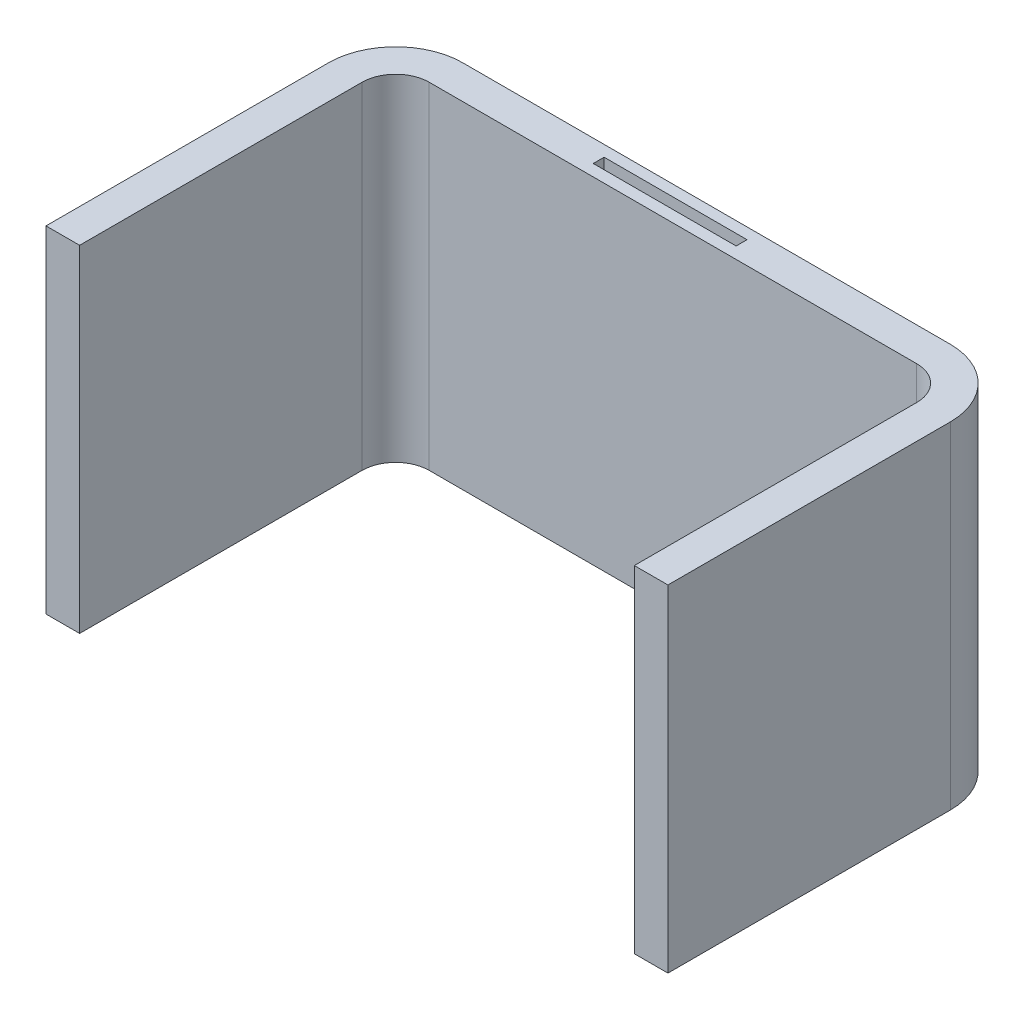
ISO-10303-21;
HEADER;
FILE_DESCRIPTION(('STEP AP214'),'2;1');
FILE_NAME('part.step','',(''),(''),'','','');
FILE_SCHEMA(('AUTOMOTIVE_DESIGN { 1 0 10303 214 1 1 1 1 }'));
ENDSEC;
DATA;
#1=APPLICATION_CONTEXT('core data for automotive mechanical design processes');
#2=APPLICATION_PROTOCOL_DEFINITION('international standard','automotive_design',2000,#1);
#3=PRODUCT_CONTEXT('',#1,'mechanical');
#4=PRODUCT('Part','Part','',(#3));
#5=PRODUCT_RELATED_PRODUCT_CATEGORY('part','',(#4));
#6=PRODUCT_DEFINITION_FORMATION('','',#4);
#7=PRODUCT_DEFINITION_CONTEXT('part definition',#1,'design');
#8=PRODUCT_DEFINITION('design','',#6,#7);
#9=PRODUCT_DEFINITION_SHAPE('','',#8);
#10=(LENGTH_UNIT() NAMED_UNIT(*) SI_UNIT(.MILLI.,.METRE.));
#11=(NAMED_UNIT(*) PLANE_ANGLE_UNIT() SI_UNIT($,.RADIAN.));
#12=(NAMED_UNIT(*) SI_UNIT($,.STERADIAN.) SOLID_ANGLE_UNIT());
#13=UNCERTAINTY_MEASURE_WITH_UNIT(LENGTH_MEASURE(1.E-05),#10,'distance_accuracy_value','');
#14=(GEOMETRIC_REPRESENTATION_CONTEXT(3) GLOBAL_UNCERTAINTY_ASSIGNED_CONTEXT((#13)) GLOBAL_UNIT_ASSIGNED_CONTEXT((#10,
#11,#12)) REPRESENTATION_CONTEXT('',''));
#15=CARTESIAN_POINT('',(0.,0.,0.));
#16=DIRECTION('',(0.,0.,1.));
#17=DIRECTION('',(1.,0.,0.));
#18=AXIS2_PLACEMENT_3D('',#15,#16,#17);
#19=CARTESIAN_POINT('',(-14.3283559492958,20.,-16.0103674135984));
#20=DIRECTION('',(0.,-1.,0.));
#21=DIRECTION('',(0.,0.,-1.));
#22=AXIS2_PLACEMENT_3D('',#19,#20,#21);
#23=PLANE('',#22);
#24=DIRECTION('',(1.,0.,0.));
#25=VECTOR('',#24,1.);
#26=CARTESIAN_POINT('',(-18.3283559492958,20.,0.789632586401575));
#27=LINE('',#26,#25);
#28=CARTESIAN_POINT('',(-18.3283559492958,20.,0.789632586401575));
#29=VERTEX_POINT('',#28);
#30=CARTESIAN_POINT('',(-16.3283559492958,20.,0.789632586401575));
#31=VERTEX_POINT('',#30);
#32=EDGE_CURVE('E188',#29,#31,#27,.T.);
#33=ORIENTED_EDGE('',*,*,#32,.T.);
#34=DIRECTION('',(0.,0.,-1.));
#35=VECTOR('',#34,1.);
#36=CARTESIAN_POINT('',(-16.3283559492958,20.,0.789632586401575));
#37=LINE('',#36,#35);
#38=CARTESIAN_POINT('',(-16.3283559492958,20.,-16.0103674135984));
#39=VERTEX_POINT('',#38);
#40=EDGE_CURVE('E191',#31,#39,#37,.T.);
#41=ORIENTED_EDGE('',*,*,#40,.T.);
#42=CARTESIAN_POINT('',(-14.3283559492958,20.,-16.0103674135984));
#43=DIRECTION('',(0.,-1.,0.));
#44=DIRECTION('',(0.,0.,-1.));
#45=AXIS2_PLACEMENT_3D('',#42,#43,#44);
#46=CIRCLE('',#45,2.);
#47=CARTESIAN_POINT('',(-14.3283559492958,20.,-18.0103674135984));
#48=VERTEX_POINT('',#47);
#49=EDGE_CURVE('E194',#39,#48,#46,.T.);
#50=ORIENTED_EDGE('',*,*,#49,.T.);
#51=DIRECTION('',(1.,0.,0.));
#52=VECTOR('',#51,1.);
#53=CARTESIAN_POINT('',(-14.3283559492958,20.,-18.0103674135984));
#54=LINE('',#53,#52);
#55=CARTESIAN_POINT('',(14.6716440507042,20.,-18.0103674135984));
#56=VERTEX_POINT('',#55);
#57=EDGE_CURVE('E196',#48,#56,#54,.T.);
#58=ORIENTED_EDGE('',*,*,#57,.T.);
#59=CARTESIAN_POINT('',(14.6716440507042,20.,-16.0103674135984));
#60=DIRECTION('',(0.,-1.,0.));
#61=DIRECTION('',(0.,0.,-1.));
#62=AXIS2_PLACEMENT_3D('',#59,#60,#61);
#63=CIRCLE('',#62,2.);
#64=CARTESIAN_POINT('',(16.6716440507042,20.,-16.0103674135984));
#65=VERTEX_POINT('',#64);
#66=EDGE_CURVE('E198',#56,#65,#63,.T.);
#67=ORIENTED_EDGE('',*,*,#66,.T.);
#68=DIRECTION('',(0.,0.,1.));
#69=VECTOR('',#68,1.);
#70=CARTESIAN_POINT('',(16.6716440507042,20.,-16.0103674135984));
#71=LINE('',#70,#69);
#72=CARTESIAN_POINT('',(16.6716440507042,20.,0.789632586401575));
#73=VERTEX_POINT('',#72);
#74=EDGE_CURVE('E200',#65,#73,#71,.T.);
#75=ORIENTED_EDGE('',*,*,#74,.T.);
#76=DIRECTION('',(1.,0.,0.));
#77=VECTOR('',#76,1.);
#78=CARTESIAN_POINT('',(16.6716440507042,20.,0.789632586401575));
#79=LINE('',#78,#77);
#80=CARTESIAN_POINT('',(18.6716440507042,20.,0.789632586401575));
#81=VERTEX_POINT('',#80);
#82=EDGE_CURVE('E202',#73,#81,#79,.T.);
#83=ORIENTED_EDGE('',*,*,#82,.T.);
#84=DIRECTION('',(0.,0.,-1.));
#85=VECTOR('',#84,1.);
#86=CARTESIAN_POINT('',(18.6716440507042,20.,0.789632586401575));
#87=LINE('',#86,#85);
#88=CARTESIAN_POINT('',(18.6716440507042,20.,-16.0103674135984));
#89=VERTEX_POINT('',#88);
#90=EDGE_CURVE('E204',#81,#89,#87,.T.);
#91=ORIENTED_EDGE('',*,*,#90,.T.);
#92=CARTESIAN_POINT('',(14.6716440507042,20.,-16.0103674135984));
#93=DIRECTION('',(0.,1.,0.));
#94=DIRECTION('',(0.,0.,-1.));
#95=AXIS2_PLACEMENT_3D('',#92,#93,#94);
#96=CIRCLE('',#95,4.);
#97=CARTESIAN_POINT('',(14.6716440507042,20.,-20.0103674135984));
#98=VERTEX_POINT('',#97);
#99=EDGE_CURVE('E206',#89,#98,#96,.T.);
#100=ORIENTED_EDGE('',*,*,#99,.T.);
#101=DIRECTION('',(-1.,0.,0.));
#102=VECTOR('',#101,1.);
#103=CARTESIAN_POINT('',(-14.3283559492958,20.,-20.0103674135984));
#104=LINE('',#103,#102);
#105=CARTESIAN_POINT('',(-14.3283559492958,20.,-20.0103674135984));
#106=VERTEX_POINT('',#105);
#107=EDGE_CURVE('E208',#98,#106,#104,.T.);
#108=ORIENTED_EDGE('',*,*,#107,.T.);
#109=CARTESIAN_POINT('',(-14.3283559492958,20.,-16.0103674135984));
#110=DIRECTION('',(0.,1.,0.));
#111=DIRECTION('',(0.,0.,-1.));
#112=AXIS2_PLACEMENT_3D('',#109,#110,#111);
#113=CIRCLE('',#112,4.);
#114=CARTESIAN_POINT('',(-18.3283559492958,20.,-16.0103674135984));
#115=VERTEX_POINT('',#114);
#116=EDGE_CURVE('E210',#106,#115,#113,.T.);
#117=ORIENTED_EDGE('',*,*,#116,.T.);
#118=DIRECTION('',(0.,0.,1.));
#119=VECTOR('',#118,1.);
#120=CARTESIAN_POINT('',(-18.3283559492958,20.,-9.01036741359843));
#121=LINE('',#120,#119);
#122=EDGE_CURVE('E212',#115,#29,#121,.T.);
#123=ORIENTED_EDGE('',*,*,#122,.T.);
#124=EDGE_LOOP('',(#33,#41,#50,#58,#67,#75,#83,#91,#100,#108,#117,#123));
#125=FACE_BOUND('',#124,.T.);
#126=DIRECTION('',(0.,0.,-1.));
#127=VECTOR('',#126,1.);
#128=CARTESIAN_POINT('',(3.23643700371143,20.,-19.3510358823376));
#129=LINE('',#128,#127);
#130=CARTESIAN_POINT('',(3.23643700371143,20.,-18.703336568247));
#131=VERTEX_POINT('',#130);
#132=CARTESIAN_POINT('',(3.23643700371143,20.,-19.3510358823376));
#133=VERTEX_POINT('',#132);
#134=EDGE_CURVE('E152',#131,#133,#129,.T.);
#135=ORIENTED_EDGE('',*,*,#134,.F.);
#136=DIRECTION('',(1.,0.,0.));
#137=VECTOR('',#136,1.);
#138=CARTESIAN_POINT('',(-5.26461649372768,20.,-18.703336568247));
#139=LINE('',#138,#137);
#140=CARTESIAN_POINT('',(-5.26461649372768,20.,-18.703336568247));
#141=VERTEX_POINT('',#140);
#142=EDGE_CURVE('E174',#141,#131,#139,.T.);
#143=ORIENTED_EDGE('',*,*,#142,.F.);
#144=DIRECTION('',(0.,0.,1.));
#145=VECTOR('',#144,1.);
#146=CARTESIAN_POINT('',(-5.26461649372768,20.,-19.3510358823376));
#147=LINE('',#146,#145);
#148=CARTESIAN_POINT('',(-5.26461649372768,20.,-19.3510358823376));
#149=VERTEX_POINT('',#148);
#150=EDGE_CURVE('E172',#149,#141,#147,.T.);
#151=ORIENTED_EDGE('',*,*,#150,.F.);
#152=DIRECTION('',(-1.,0.,0.));
#153=VECTOR('',#152,1.);
#154=CARTESIAN_POINT('',(-5.26461649372768,20.,-19.3510358823376));
#155=LINE('',#154,#153);
#156=EDGE_CURVE('E160',#133,#149,#155,.T.);
#157=ORIENTED_EDGE('',*,*,#156,.F.);
#158=EDGE_LOOP('',(#135,#143,#151,#157));
#159=FACE_BOUND('',#158,.T.);
#160=ADVANCED_FACE('F39',(#125,#159),#23,.F.);
#161=CARTESIAN_POINT('',(-14.3283559492958,0.,-16.0103674135984));
#162=DIRECTION('',(0.,-1.,0.));
#163=DIRECTION('',(0.,0.,-1.));
#164=AXIS2_PLACEMENT_3D('',#161,#162,#163);
#165=PLANE('',#164);
#166=DIRECTION('',(1.,0.,0.));
#167=VECTOR('',#166,1.);
#168=CARTESIAN_POINT('',(-18.3283559492958,0.,0.789632586401575));
#169=LINE('',#168,#167);
#170=CARTESIAN_POINT('',(-18.3283559492958,0.,0.789632586401575));
#171=VERTEX_POINT('',#170);
#172=CARTESIAN_POINT('',(-16.3283559492958,0.,0.789632586401575));
#173=VERTEX_POINT('',#172);
#174=EDGE_CURVE('E168',#171,#173,#169,.T.);
#175=ORIENTED_EDGE('',*,*,#174,.F.);
#176=DIRECTION('',(0.,0.,1.));
#177=VECTOR('',#176,1.);
#178=CARTESIAN_POINT('',(-18.3283559492958,0.,0.789632586401575));
#179=LINE('',#178,#177);
#180=CARTESIAN_POINT('',(-18.3283559492958,0.,-16.0103674135984));
#181=VERTEX_POINT('',#180);
#182=EDGE_CURVE('E192',#181,#171,#179,.T.);
#183=ORIENTED_EDGE('',*,*,#182,.F.);
#184=CARTESIAN_POINT('',(-14.3283559492958,0.,-16.0103674135984));
#185=DIRECTION('',(0.,1.,0.));
#186=DIRECTION('',(0.,0.,-1.));
#187=AXIS2_PLACEMENT_3D('',#184,#185,#186);
#188=CIRCLE('',#187,4.);
#189=CARTESIAN_POINT('',(-14.3283559492958,0.,-20.0103674135984));
#190=VERTEX_POINT('',#189);
#191=EDGE_CURVE('E237',#190,#181,#188,.T.);
#192=ORIENTED_EDGE('',*,*,#191,.F.);
#193=DIRECTION('',(-1.,0.,0.));
#194=VECTOR('',#193,1.);
#195=CARTESIAN_POINT('',(-14.3283559492958,0.,-20.0103674135984));
#196=LINE('',#195,#194);
#197=CARTESIAN_POINT('',(14.6716440507042,0.,-20.0103674135984));
#198=VERTEX_POINT('',#197);
#199=EDGE_CURVE('E235',#198,#190,#196,.T.);
#200=ORIENTED_EDGE('',*,*,#199,.F.);
#201=CARTESIAN_POINT('',(14.6716440507042,0.,-16.0103674135984));
#202=DIRECTION('',(0.,1.,0.));
#203=DIRECTION('',(0.,0.,-1.));
#204=AXIS2_PLACEMENT_3D('',#201,#202,#203);
#205=CIRCLE('',#204,4.);
#206=CARTESIAN_POINT('',(18.6716440507042,0.,-16.0103674135984));
#207=VERTEX_POINT('',#206);
#208=EDGE_CURVE('E233',#207,#198,#205,.T.);
#209=ORIENTED_EDGE('',*,*,#208,.F.);
#210=DIRECTION('',(0.,0.,-1.));
#211=VECTOR('',#210,1.);
#212=CARTESIAN_POINT('',(18.6716440507042,0.,-16.0103674135984));
#213=LINE('',#212,#211);
#214=CARTESIAN_POINT('',(18.6716440507042,0.,0.789632586401575));
#215=VERTEX_POINT('',#214);
#216=EDGE_CURVE('E231',#215,#207,#213,.T.);
#217=ORIENTED_EDGE('',*,*,#216,.F.);
#218=DIRECTION('',(1.,0.,0.));
#219=VECTOR('',#218,1.);
#220=CARTESIAN_POINT('',(16.6716440507042,0.,0.789632586401575));
#221=LINE('',#220,#219);
#222=CARTESIAN_POINT('',(16.6716440507042,0.,0.789632586401575));
#223=VERTEX_POINT('',#222);
#224=EDGE_CURVE('E228',#223,#215,#221,.T.);
#225=ORIENTED_EDGE('',*,*,#224,.F.);
#226=DIRECTION('',(0.,0.,1.));
#227=VECTOR('',#226,1.);
#228=CARTESIAN_POINT('',(16.6716440507042,0.,0.789632586401575));
#229=LINE('',#228,#227);
#230=CARTESIAN_POINT('',(16.6716440507042,0.,-16.0103674135984));
#231=VERTEX_POINT('',#230);
#232=EDGE_CURVE('E226',#231,#223,#229,.T.);
#233=ORIENTED_EDGE('',*,*,#232,.F.);
#234=CARTESIAN_POINT('',(14.6716440507042,0.,-16.0103674135984));
#235=DIRECTION('',(0.,-1.,0.));
#236=DIRECTION('',(0.,0.,-1.));
#237=AXIS2_PLACEMENT_3D('',#234,#235,#236);
#238=CIRCLE('',#237,2.);
#239=CARTESIAN_POINT('',(14.6716440507042,0.,-18.0103674135984));
#240=VERTEX_POINT('',#239);
#241=EDGE_CURVE('E223',#240,#231,#238,.T.);
#242=ORIENTED_EDGE('',*,*,#241,.F.);
#243=DIRECTION('',(1.,0.,0.));
#244=VECTOR('',#243,1.);
#245=CARTESIAN_POINT('',(-14.3283559492958,0.,-18.0103674135984));
#246=LINE('',#245,#244);
#247=CARTESIAN_POINT('',(-14.3283559492958,0.,-18.0103674135984));
#248=VERTEX_POINT('',#247);
#249=EDGE_CURVE('E221',#248,#240,#246,.T.);
#250=ORIENTED_EDGE('',*,*,#249,.F.);
#251=CARTESIAN_POINT('',(-14.3283559492958,0.,-16.0103674135984));
#252=DIRECTION('',(0.,-1.,0.));
#253=DIRECTION('',(0.,0.,-1.));
#254=AXIS2_PLACEMENT_3D('',#251,#252,#253);
#255=CIRCLE('',#254,2.);
#256=CARTESIAN_POINT('',(-16.3283559492958,0.,-16.0103674135984));
#257=VERTEX_POINT('',#256);
#258=EDGE_CURVE('E219',#257,#248,#255,.T.);
#259=ORIENTED_EDGE('',*,*,#258,.F.);
#260=DIRECTION('',(0.,0.,-1.));
#261=VECTOR('',#260,1.);
#262=CARTESIAN_POINT('',(-16.3283559492958,0.,-9.01036741359843));
#263=LINE('',#262,#261);
#264=EDGE_CURVE('E217',#173,#257,#263,.T.);
#265=ORIENTED_EDGE('',*,*,#264,.F.);
#266=EDGE_LOOP('',(#175,#183,#192,#200,#209,#217,#225,#233,#242,#250,#259,#265));
#267=FACE_BOUND('',#266,.T.);
#268=DIRECTION('',(1.,0.,0.));
#269=VECTOR('',#268,1.);
#270=CARTESIAN_POINT('',(-5.26461649372768,0.,-18.703336568247));
#271=LINE('',#270,#269);
#272=CARTESIAN_POINT('',(-5.26461649372768,0.,-18.703336568247));
#273=VERTEX_POINT('',#272);
#274=CARTESIAN_POINT('',(3.23643700371143,0.,-18.703336568247));
#275=VERTEX_POINT('',#274);
#276=EDGE_CURVE('E161',#273,#275,#271,.T.);
#277=ORIENTED_EDGE('',*,*,#276,.T.);
#278=DIRECTION('',(0.,0.,-1.));
#279=VECTOR('',#278,1.);
#280=CARTESIAN_POINT('',(3.23643700371143,0.,-19.3510358823376));
#281=LINE('',#280,#279);
#282=CARTESIAN_POINT('',(3.23643700371143,0.,-19.3510358823376));
#283=VERTEX_POINT('',#282);
#284=EDGE_CURVE('E62',#275,#283,#281,.T.);
#285=ORIENTED_EDGE('',*,*,#284,.T.);
#286=DIRECTION('',(-1.,0.,0.));
#287=VECTOR('',#286,1.);
#288=CARTESIAN_POINT('',(-5.26461649372768,0.,-19.3510358823376));
#289=LINE('',#288,#287);
#290=CARTESIAN_POINT('',(-5.26461649372768,0.,-19.3510358823376));
#291=VERTEX_POINT('',#290);
#292=EDGE_CURVE('E167',#283,#291,#289,.T.);
#293=ORIENTED_EDGE('',*,*,#292,.T.);
#294=DIRECTION('',(0.,0.,1.));
#295=VECTOR('',#294,1.);
#296=CARTESIAN_POINT('',(-5.26461649372768,0.,-19.3510358823376));
#297=LINE('',#296,#295);
#298=EDGE_CURVE('E180',#291,#273,#297,.T.);
#299=ORIENTED_EDGE('',*,*,#298,.T.);
#300=EDGE_LOOP('',(#277,#285,#293,#299));
#301=FACE_BOUND('',#300,.T.);
#302=ADVANCED_FACE('F280',(#267,#301),#165,.T.);
#303=CARTESIAN_POINT('',(-18.3283559492958,20.,0.789632586401575));
#304=DIRECTION('',(0.,0.,-1.));
#305=DIRECTION('',(-1.,0.,0.));
#306=AXIS2_PLACEMENT_3D('',#303,#304,#305);
#307=PLANE('',#306);
#308=ORIENTED_EDGE('',*,*,#174,.T.);
#309=DIRECTION('',(0.,-1.,0.));
#310=VECTOR('',#309,1.);
#311=CARTESIAN_POINT('',(-16.3283559492958,20.,0.789632586401575));
#312=LINE('',#311,#310);
#313=EDGE_CURVE('E11',#31,#173,#312,.T.);
#314=ORIENTED_EDGE('',*,*,#313,.F.);
#315=ORIENTED_EDGE('',*,*,#32,.F.);
#316=DIRECTION('',(0.,-1.,0.));
#317=VECTOR('',#316,1.);
#318=CARTESIAN_POINT('',(-18.3283559492958,20.,0.789632586401575));
#319=LINE('',#318,#317);
#320=EDGE_CURVE('E214',#29,#171,#319,.T.);
#321=ORIENTED_EDGE('',*,*,#320,.T.);
#322=EDGE_LOOP('',(#308,#314,#315,#321));
#323=FACE_BOUND('',#322,.T.);
#324=ADVANCED_FACE('F41',(#323),#307,.F.);
#325=CARTESIAN_POINT('',(-16.3283559492958,20.,-9.01036741359843));
#326=DIRECTION('',(-1.,0.,0.));
#327=DIRECTION('',(0.,0.,1.));
#328=AXIS2_PLACEMENT_3D('',#325,#326,#327);
#329=PLANE('',#328);
#330=ORIENTED_EDGE('',*,*,#264,.T.);
#331=DIRECTION('',(0.,-1.,0.));
#332=VECTOR('',#331,1.);
#333=CARTESIAN_POINT('',(-16.3283559492958,20.,-16.0103674135984));
#334=LINE('',#333,#332);
#335=EDGE_CURVE('E47',#39,#257,#334,.T.);
#336=ORIENTED_EDGE('',*,*,#335,.F.);
#337=ORIENTED_EDGE('',*,*,#40,.F.);
#338=ORIENTED_EDGE('',*,*,#313,.T.);
#339=EDGE_LOOP('',(#330,#336,#337,#338));
#340=FACE_BOUND('',#339,.T.);
#341=ADVANCED_FACE('F296',(#340),#329,.F.);
#342=CARTESIAN_POINT('',(-14.3283559492958,20.,-16.0103674135984));
#343=DIRECTION('',(0.,-1.,0.));
#344=DIRECTION('',(0.,0.,-1.));
#345=AXIS2_PLACEMENT_3D('',#342,#343,#344);
#346=CYLINDRICAL_SURFACE('',#345,2.);
#347=ORIENTED_EDGE('',*,*,#258,.T.);
#348=DIRECTION('',(0.,-1.,0.));
#349=VECTOR('',#348,1.);
#350=CARTESIAN_POINT('',(-14.3283559492958,20.,-18.0103674135984));
#351=LINE('',#350,#349);
#352=EDGE_CURVE('E267',#48,#248,#351,.T.);
#353=ORIENTED_EDGE('',*,*,#352,.F.);
#354=ORIENTED_EDGE('',*,*,#49,.F.);
#355=ORIENTED_EDGE('',*,*,#335,.T.);
#356=EDGE_LOOP('',(#347,#353,#354,#355));
#357=FACE_BOUND('',#356,.T.);
#358=ADVANCED_FACE('F274',(#357),#346,.F.);
#359=CARTESIAN_POINT('',(-14.3283559492958,20.,-18.0103674135984));
#360=DIRECTION('',(0.,0.,-1.));
#361=DIRECTION('',(-1.,0.,0.));
#362=AXIS2_PLACEMENT_3D('',#359,#360,#361);
#363=PLANE('',#362);
#364=ORIENTED_EDGE('',*,*,#249,.T.);
#365=DIRECTION('',(0.,-1.,0.));
#366=VECTOR('',#365,1.);
#367=CARTESIAN_POINT('',(14.6716440507042,20.,-18.0103674135984));
#368=LINE('',#367,#366);
#369=EDGE_CURVE('E264',#56,#240,#368,.T.);
#370=ORIENTED_EDGE('',*,*,#369,.F.);
#371=ORIENTED_EDGE('',*,*,#57,.F.);
#372=ORIENTED_EDGE('',*,*,#352,.T.);
#373=EDGE_LOOP('',(#364,#370,#371,#372));
#374=FACE_BOUND('',#373,.T.);
#375=ADVANCED_FACE('F285',(#374),#363,.F.);
#376=CARTESIAN_POINT('',(14.6716440507042,20.,-16.0103674135984));
#377=DIRECTION('',(0.,-1.,0.));
#378=DIRECTION('',(0.,0.,-1.));
#379=AXIS2_PLACEMENT_3D('',#376,#377,#378);
#380=CYLINDRICAL_SURFACE('',#379,2.);
#381=ORIENTED_EDGE('',*,*,#241,.T.);
#382=DIRECTION('',(0.,-1.,0.));
#383=VECTOR('',#382,1.);
#384=CARTESIAN_POINT('',(16.6716440507042,20.,-16.0103674135984));
#385=LINE('',#384,#383);
#386=EDGE_CURVE('E261',#65,#231,#385,.T.);
#387=ORIENTED_EDGE('',*,*,#386,.F.);
#388=ORIENTED_EDGE('',*,*,#66,.F.);
#389=ORIENTED_EDGE('',*,*,#369,.T.);
#390=EDGE_LOOP('',(#381,#387,#388,#389));
#391=FACE_BOUND('',#390,.T.);
#392=ADVANCED_FACE('F289',(#391),#380,.F.);
#393=CARTESIAN_POINT('',(16.6716440507042,20.,0.789632586401575));
#394=DIRECTION('',(1.,0.,0.));
#395=DIRECTION('',(0.,0.,-1.));
#396=AXIS2_PLACEMENT_3D('',#393,#394,#395);
#397=PLANE('',#396);
#398=ORIENTED_EDGE('',*,*,#232,.T.);
#399=DIRECTION('',(0.,-1.,0.));
#400=VECTOR('',#399,1.);
#401=CARTESIAN_POINT('',(16.6716440507042,20.,0.789632586401575));
#402=LINE('',#401,#400);
#403=EDGE_CURVE('E258',#73,#223,#402,.T.);
#404=ORIENTED_EDGE('',*,*,#403,.F.);
#405=ORIENTED_EDGE('',*,*,#74,.F.);
#406=ORIENTED_EDGE('',*,*,#386,.T.);
#407=EDGE_LOOP('',(#398,#404,#405,#406));
#408=FACE_BOUND('',#407,.T.);
#409=ADVANCED_FACE('F327',(#408),#397,.F.);
#410=CARTESIAN_POINT('',(16.6716440507042,20.,0.789632586401575));
#411=DIRECTION('',(0.,0.,-1.));
#412=DIRECTION('',(-1.,0.,0.));
#413=AXIS2_PLACEMENT_3D('',#410,#411,#412);
#414=PLANE('',#413);
#415=ORIENTED_EDGE('',*,*,#224,.T.);
#416=DIRECTION('',(0.,-1.,0.));
#417=VECTOR('',#416,1.);
#418=CARTESIAN_POINT('',(18.6716440507042,20.,0.789632586401575));
#419=LINE('',#418,#417);
#420=EDGE_CURVE('E255',#81,#215,#419,.T.);
#421=ORIENTED_EDGE('',*,*,#420,.F.);
#422=ORIENTED_EDGE('',*,*,#82,.F.);
#423=ORIENTED_EDGE('',*,*,#403,.T.);
#424=EDGE_LOOP('',(#415,#421,#422,#423));
#425=FACE_BOUND('',#424,.T.);
#426=ADVANCED_FACE('F325',(#425),#414,.F.);
#427=CARTESIAN_POINT('',(18.6716440507042,20.,-16.0103674135984));
#428=DIRECTION('',(-1.,0.,0.));
#429=DIRECTION('',(0.,0.,1.));
#430=AXIS2_PLACEMENT_3D('',#427,#428,#429);
#431=PLANE('',#430);
#432=ORIENTED_EDGE('',*,*,#216,.T.);
#433=DIRECTION('',(0.,-1.,0.));
#434=VECTOR('',#433,1.);
#435=CARTESIAN_POINT('',(18.6716440507042,20.,-16.0103674135984));
#436=LINE('',#435,#434);
#437=EDGE_CURVE('E252',#89,#207,#436,.T.);
#438=ORIENTED_EDGE('',*,*,#437,.F.);
#439=ORIENTED_EDGE('',*,*,#90,.F.);
#440=ORIENTED_EDGE('',*,*,#420,.T.);
#441=EDGE_LOOP('',(#432,#438,#439,#440));
#442=FACE_BOUND('',#441,.T.);
#443=ADVANCED_FACE('F321',(#442),#431,.F.);
#444=CARTESIAN_POINT('',(14.6716440507042,20.,-16.0103674135984));
#445=DIRECTION('',(0.,-1.,0.));
#446=DIRECTION('',(0.,0.,-1.));
#447=AXIS2_PLACEMENT_3D('',#444,#445,#446);
#448=CYLINDRICAL_SURFACE('',#447,4.);
#449=ORIENTED_EDGE('',*,*,#208,.T.);
#450=DIRECTION('',(0.,-1.,0.));
#451=VECTOR('',#450,1.);
#452=CARTESIAN_POINT('',(14.6716440507042,20.,-20.0103674135984));
#453=LINE('',#452,#451);
#454=EDGE_CURVE('E249',#98,#198,#453,.T.);
#455=ORIENTED_EDGE('',*,*,#454,.F.);
#456=ORIENTED_EDGE('',*,*,#99,.F.);
#457=ORIENTED_EDGE('',*,*,#437,.T.);
#458=EDGE_LOOP('',(#449,#455,#456,#457));
#459=FACE_BOUND('',#458,.T.);
#460=ADVANCED_FACE('F317',(#459),#448,.T.);
#461=CARTESIAN_POINT('',(-14.3283559492958,20.,-20.0103674135984));
#462=DIRECTION('',(0.,0.,1.));
#463=DIRECTION('',(1.,0.,0.));
#464=AXIS2_PLACEMENT_3D('',#461,#462,#463);
#465=PLANE('',#464);
#466=ORIENTED_EDGE('',*,*,#199,.T.);
#467=DIRECTION('',(0.,-1.,0.));
#468=VECTOR('',#467,1.);
#469=CARTESIAN_POINT('',(-14.3283559492958,20.,-20.0103674135984));
#470=LINE('',#469,#468);
#471=EDGE_CURVE('E246',#106,#190,#470,.T.);
#472=ORIENTED_EDGE('',*,*,#471,.F.);
#473=ORIENTED_EDGE('',*,*,#107,.F.);
#474=ORIENTED_EDGE('',*,*,#454,.T.);
#475=EDGE_LOOP('',(#466,#472,#473,#474));
#476=FACE_BOUND('',#475,.T.);
#477=ADVANCED_FACE('F313',(#476),#465,.F.);
#478=CARTESIAN_POINT('',(-14.3283559492958,20.,-16.0103674135984));
#479=DIRECTION('',(0.,-1.,0.));
#480=DIRECTION('',(0.,0.,-1.));
#481=AXIS2_PLACEMENT_3D('',#478,#479,#480);
#482=CYLINDRICAL_SURFACE('',#481,4.);
#483=ORIENTED_EDGE('',*,*,#191,.T.);
#484=DIRECTION('',(0.,-1.,0.));
#485=VECTOR('',#484,1.);
#486=CARTESIAN_POINT('',(-18.3283559492958,20.,-16.0103674135984));
#487=LINE('',#486,#485);
#488=EDGE_CURVE('E243',#115,#181,#487,.T.);
#489=ORIENTED_EDGE('',*,*,#488,.F.);
#490=ORIENTED_EDGE('',*,*,#116,.F.);
#491=ORIENTED_EDGE('',*,*,#471,.T.);
#492=EDGE_LOOP('',(#483,#489,#490,#491));
#493=FACE_BOUND('',#492,.T.);
#494=ADVANCED_FACE('F304',(#493),#482,.T.);
#495=CARTESIAN_POINT('',(-18.3283559492958,20.,0.789632586401575));
#496=DIRECTION('',(1.,0.,0.));
#497=DIRECTION('',(0.,0.,-1.));
#498=AXIS2_PLACEMENT_3D('',#495,#496,#497);
#499=PLANE('',#498);
#500=ORIENTED_EDGE('',*,*,#182,.T.);
#501=ORIENTED_EDGE('',*,*,#320,.F.);
#502=ORIENTED_EDGE('',*,*,#122,.F.);
#503=ORIENTED_EDGE('',*,*,#488,.T.);
#504=EDGE_LOOP('',(#500,#501,#502,#503));
#505=FACE_BOUND('',#504,.T.);
#506=ADVANCED_FACE('F308',(#505),#499,.F.);
#507=CARTESIAN_POINT('',(3.23643700371143,20.,-19.3510358823376));
#508=DIRECTION('',(-1.,0.,0.));
#509=DIRECTION('',(0.,0.,1.));
#510=AXIS2_PLACEMENT_3D('',#507,#508,#509);
#511=PLANE('',#510);
#512=ORIENTED_EDGE('',*,*,#284,.F.);
#513=DIRECTION('',(0.,-1.,0.));
#514=VECTOR('',#513,1.);
#515=CARTESIAN_POINT('',(3.23643700371143,20.,-18.703336568247));
#516=LINE('',#515,#514);
#517=EDGE_CURVE('E156',#131,#275,#516,.T.);
#518=ORIENTED_EDGE('',*,*,#517,.F.);
#519=ORIENTED_EDGE('',*,*,#134,.T.);
#520=DIRECTION('',(0.,-1.,0.));
#521=VECTOR('',#520,1.);
#522=CARTESIAN_POINT('',(3.23643700371143,20.,-19.3510358823376));
#523=LINE('',#522,#521);
#524=EDGE_CURVE('E155',#133,#283,#523,.T.);
#525=ORIENTED_EDGE('',*,*,#524,.T.);
#526=EDGE_LOOP('',(#512,#518,#519,#525));
#527=FACE_BOUND('',#526,.T.);
#528=ADVANCED_FACE('F154',(#527),#511,.T.);
#529=CARTESIAN_POINT('',(-5.26461649372768,20.,-19.3510358823376));
#530=DIRECTION('',(0.,0.,1.));
#531=DIRECTION('',(1.,0.,0.));
#532=AXIS2_PLACEMENT_3D('',#529,#530,#531);
#533=PLANE('',#532);
#534=ORIENTED_EDGE('',*,*,#292,.F.);
#535=ORIENTED_EDGE('',*,*,#524,.F.);
#536=ORIENTED_EDGE('',*,*,#156,.T.);
#537=DIRECTION('',(0.,-1.,0.));
#538=VECTOR('',#537,1.);
#539=CARTESIAN_POINT('',(-5.26461649372768,20.,-19.3510358823376));
#540=LINE('',#539,#538);
#541=EDGE_CURVE('E169',#149,#291,#540,.T.);
#542=ORIENTED_EDGE('',*,*,#541,.T.);
#543=EDGE_LOOP('',(#534,#535,#536,#542));
#544=FACE_BOUND('',#543,.T.);
#545=ADVANCED_FACE('F164',(#544),#533,.T.);
#546=CARTESIAN_POINT('',(-5.26461649372768,20.,-19.3510358823376));
#547=DIRECTION('',(1.,0.,0.));
#548=DIRECTION('',(0.,0.,-1.));
#549=AXIS2_PLACEMENT_3D('',#546,#547,#548);
#550=PLANE('',#549);
#551=ORIENTED_EDGE('',*,*,#298,.F.);
#552=ORIENTED_EDGE('',*,*,#541,.F.);
#553=ORIENTED_EDGE('',*,*,#150,.T.);
#554=DIRECTION('',(0.,-1.,0.));
#555=VECTOR('',#554,1.);
#556=CARTESIAN_POINT('',(-5.26461649372768,20.,-18.703336568247));
#557=LINE('',#556,#555);
#558=EDGE_CURVE('E54',#141,#273,#557,.T.);
#559=ORIENTED_EDGE('',*,*,#558,.T.);
#560=EDGE_LOOP('',(#551,#552,#553,#559));
#561=FACE_BOUND('',#560,.T.);
#562=ADVANCED_FACE('F391',(#561),#550,.T.);
#563=CARTESIAN_POINT('',(-5.26461649372768,20.,-18.703336568247));
#564=DIRECTION('',(0.,0.,-1.));
#565=DIRECTION('',(-1.,0.,0.));
#566=AXIS2_PLACEMENT_3D('',#563,#564,#565);
#567=PLANE('',#566);
#568=ORIENTED_EDGE('',*,*,#276,.F.);
#569=ORIENTED_EDGE('',*,*,#558,.F.);
#570=ORIENTED_EDGE('',*,*,#142,.T.);
#571=ORIENTED_EDGE('',*,*,#517,.T.);
#572=EDGE_LOOP('',(#568,#569,#570,#571));
#573=FACE_BOUND('',#572,.T.);
#574=ADVANCED_FACE('F398',(#573),#567,.T.);
#575=CLOSED_SHELL('',(#160,#302,#324,#341,#358,#375,#392,#409,#426,#443,#460,#477,#494,#506,
#528,#545,#562,#574));
#576=MANIFOLD_SOLID_BREP('B2',#575);
#577=ADVANCED_BREP_SHAPE_REPRESENTATION('',(#18,#576),#14);
#578=SHAPE_DEFINITION_REPRESENTATION(#9,#577);
ENDSEC;
END-ISO-10303-21;
